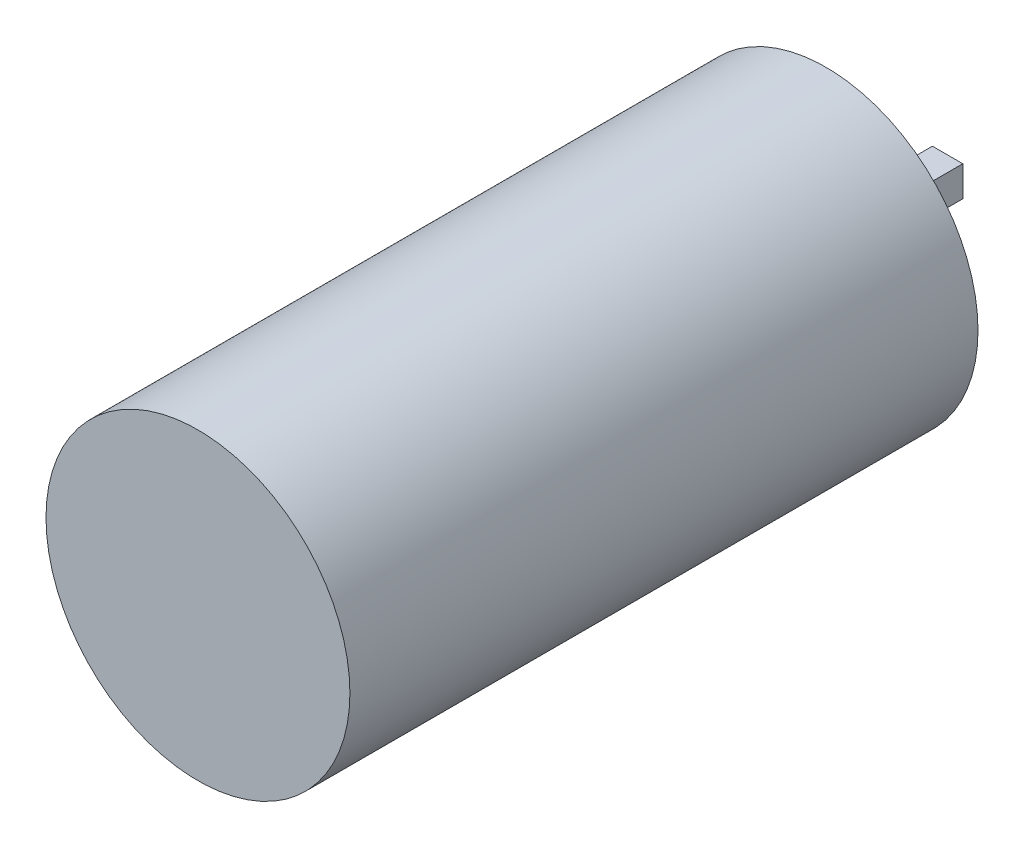
ISO-10303-21;
HEADER;
FILE_DESCRIPTION(('STEP AP214'),'2;1');
FILE_NAME('part.step','',(''),(''),'','','');
FILE_SCHEMA(('AUTOMOTIVE_DESIGN { 1 0 10303 214 1 1 1 1 }'));
ENDSEC;
DATA;
#1=APPLICATION_CONTEXT('core data for automotive mechanical design processes');
#2=APPLICATION_PROTOCOL_DEFINITION('international standard','automotive_design',2000,#1);
#3=PRODUCT_CONTEXT('',#1,'mechanical');
#4=PRODUCT('Part','Part','',(#3));
#5=PRODUCT_RELATED_PRODUCT_CATEGORY('part','',(#4));
#6=PRODUCT_DEFINITION_FORMATION('','',#4);
#7=PRODUCT_DEFINITION_CONTEXT('part definition',#1,'design');
#8=PRODUCT_DEFINITION('design','',#6,#7);
#9=PRODUCT_DEFINITION_SHAPE('','',#8);
#10=(LENGTH_UNIT() NAMED_UNIT(*) SI_UNIT(.MILLI.,.METRE.));
#11=(NAMED_UNIT(*) PLANE_ANGLE_UNIT() SI_UNIT($,.RADIAN.));
#12=(NAMED_UNIT(*) SI_UNIT($,.STERADIAN.) SOLID_ANGLE_UNIT());
#13=UNCERTAINTY_MEASURE_WITH_UNIT(LENGTH_MEASURE(1.E-05),#10,'distance_accuracy_value','');
#14=(GEOMETRIC_REPRESENTATION_CONTEXT(3) GLOBAL_UNCERTAINTY_ASSIGNED_CONTEXT((#13)) GLOBAL_UNIT_ASSIGNED_CONTEXT((#10,
#11,#12)) REPRESENTATION_CONTEXT('',''));
#15=CARTESIAN_POINT('',(0.,0.,0.));
#16=DIRECTION('',(0.,0.,1.));
#17=DIRECTION('',(1.,0.,0.));
#18=AXIS2_PLACEMENT_3D('',#15,#16,#17);
#19=CARTESIAN_POINT('',(0.,0.,0.));
#20=DIRECTION('',(0.,0.,1.));
#21=DIRECTION('',(1.,0.,0.));
#22=AXIS2_PLACEMENT_3D('',#19,#20,#21);
#23=PLANE('',#22);
#24=CARTESIAN_POINT('',(0.,0.,0.));
#25=DIRECTION('',(0.,0.,1.));
#26=DIRECTION('',(1.,0.,0.));
#27=AXIS2_PLACEMENT_3D('',#24,#25,#26);
#28=CIRCLE('',#27,15.);
#29=CARTESIAN_POINT('',(15.,0.,0.));
#30=VERTEX_POINT('',#29);
#31=EDGE_CURVE('E37',#30,#30,#28,.T.);
#32=ORIENTED_EDGE('',*,*,#31,.F.);
#33=EDGE_LOOP('',(#32));
#34=FACE_BOUND('',#33,.T.);
#35=DIRECTION('',(0.,-1.,0.));
#36=VECTOR('',#35,1.);
#37=CARTESIAN_POINT('',(1.5,-1.5,0.));
#38=LINE('',#37,#36);
#39=CARTESIAN_POINT('',(1.5,1.5,0.));
#40=VERTEX_POINT('',#39);
#41=CARTESIAN_POINT('',(1.5,-1.5,0.));
#42=VERTEX_POINT('',#41);
#43=EDGE_CURVE('E94',#40,#42,#38,.T.);
#44=ORIENTED_EDGE('',*,*,#43,.F.);
#45=DIRECTION('',(1.,0.,0.));
#46=VECTOR('',#45,1.);
#47=CARTESIAN_POINT('',(-1.5,1.5,0.));
#48=LINE('',#47,#46);
#49=CARTESIAN_POINT('',(-1.5,1.5,0.));
#50=VERTEX_POINT('',#49);
#51=EDGE_CURVE('E91',#50,#40,#48,.T.);
#52=ORIENTED_EDGE('',*,*,#51,.F.);
#53=DIRECTION('',(0.,1.,0.));
#54=VECTOR('',#53,1.);
#55=CARTESIAN_POINT('',(-1.5,-1.5,0.));
#56=LINE('',#55,#54);
#57=CARTESIAN_POINT('',(-1.5,-1.5,0.));
#58=VERTEX_POINT('',#57);
#59=EDGE_CURVE('E53',#58,#50,#56,.T.);
#60=ORIENTED_EDGE('',*,*,#59,.F.);
#61=DIRECTION('',(-1.,0.,0.));
#62=VECTOR('',#61,1.);
#63=CARTESIAN_POINT('',(-1.5,-1.5,0.));
#64=LINE('',#63,#62);
#65=EDGE_CURVE('E48',#42,#58,#64,.T.);
#66=ORIENTED_EDGE('',*,*,#65,.F.);
#67=EDGE_LOOP('',(#44,#52,#60,#66));
#68=FACE_BOUND('',#67,.T.);
#69=ADVANCED_FACE('F33',(#34,#68),#23,.F.);
#70=CARTESIAN_POINT('',(0.,0.,62.));
#71=DIRECTION('',(0.,0.,-1.));
#72=DIRECTION('',(-1.,0.,0.));
#73=AXIS2_PLACEMENT_3D('',#70,#71,#72);
#74=CYLINDRICAL_SURFACE('',#73,15.);
#75=CARTESIAN_POINT('',(0.,0.,62.));
#76=DIRECTION('',(0.,0.,1.));
#77=DIRECTION('',(1.,0.,0.));
#78=AXIS2_PLACEMENT_3D('',#75,#76,#77);
#79=CIRCLE('',#78,15.);
#80=CARTESIAN_POINT('',(15.,0.,62.));
#81=VERTEX_POINT('',#80);
#82=EDGE_CURVE('E11',#81,#81,#79,.T.);
#83=ORIENTED_EDGE('',*,*,#82,.F.);
#84=EDGE_LOOP('',(#83));
#85=FACE_BOUND('',#84,.T.);
#86=ORIENTED_EDGE('',*,*,#31,.T.);
#87=EDGE_LOOP('',(#86));
#88=FACE_BOUND('',#87,.T.);
#89=ADVANCED_FACE('F35',(#85,#88),#74,.T.);
#90=CARTESIAN_POINT('',(0.,0.,62.));
#91=DIRECTION('',(0.,0.,1.));
#92=DIRECTION('',(1.,0.,0.));
#93=AXIS2_PLACEMENT_3D('',#90,#91,#92);
#94=PLANE('',#93);
#95=ORIENTED_EDGE('',*,*,#82,.T.);
#96=EDGE_LOOP('',(#95));
#97=FACE_BOUND('',#96,.T.);
#98=ADVANCED_FACE('F120',(#97),#94,.T.);
#99=CARTESIAN_POINT('',(1.5,-1.5,-12.));
#100=DIRECTION('',(-1.,0.,0.));
#101=DIRECTION('',(0.,0.,1.));
#102=AXIS2_PLACEMENT_3D('',#99,#100,#101);
#103=PLANE('',#102);
#104=ORIENTED_EDGE('',*,*,#43,.T.);
#105=DIRECTION('',(0.,0.,1.));
#106=VECTOR('',#105,1.);
#107=CARTESIAN_POINT('',(1.5,-1.5,-12.));
#108=LINE('',#107,#106);
#109=CARTESIAN_POINT('',(1.5,-1.5,-12.));
#110=VERTEX_POINT('',#109);
#111=EDGE_CURVE('E75',#110,#42,#108,.T.);
#112=ORIENTED_EDGE('',*,*,#111,.F.);
#113=DIRECTION('',(0.,-1.,0.));
#114=VECTOR('',#113,1.);
#115=CARTESIAN_POINT('',(1.5,-1.5,-12.));
#116=LINE('',#115,#114);
#117=CARTESIAN_POINT('',(1.5,1.5,-12.));
#118=VERTEX_POINT('',#117);
#119=EDGE_CURVE('E82',#118,#110,#116,.T.);
#120=ORIENTED_EDGE('',*,*,#119,.F.);
#121=DIRECTION('',(0.,0.,1.));
#122=VECTOR('',#121,1.);
#123=CARTESIAN_POINT('',(1.5,1.5,-12.));
#124=LINE('',#123,#122);
#125=EDGE_CURVE('E102',#118,#40,#124,.T.);
#126=ORIENTED_EDGE('',*,*,#125,.T.);
#127=EDGE_LOOP('',(#104,#112,#120,#126));
#128=FACE_BOUND('',#127,.T.);
#129=ADVANCED_FACE('F93',(#128),#103,.F.);
#130=CARTESIAN_POINT('',(-1.5,-1.5,-12.));
#131=DIRECTION('',(0.,1.,0.));
#132=DIRECTION('',(-1.,0.,0.));
#133=AXIS2_PLACEMENT_3D('',#130,#131,#132);
#134=PLANE('',#133);
#135=ORIENTED_EDGE('',*,*,#65,.T.);
#136=DIRECTION('',(0.,0.,1.));
#137=VECTOR('',#136,1.);
#138=CARTESIAN_POINT('',(-1.5,-1.5,-12.));
#139=LINE('',#138,#137);
#140=CARTESIAN_POINT('',(-1.5,-1.5,-12.));
#141=VERTEX_POINT('',#140);
#142=EDGE_CURVE('E78',#141,#58,#139,.T.);
#143=ORIENTED_EDGE('',*,*,#142,.F.);
#144=DIRECTION('',(-1.,0.,0.));
#145=VECTOR('',#144,1.);
#146=CARTESIAN_POINT('',(-1.5,-1.5,-12.));
#147=LINE('',#146,#145);
#148=EDGE_CURVE('E71',#110,#141,#147,.T.);
#149=ORIENTED_EDGE('',*,*,#148,.F.);
#150=ORIENTED_EDGE('',*,*,#111,.T.);
#151=EDGE_LOOP('',(#135,#143,#149,#150));
#152=FACE_BOUND('',#151,.T.);
#153=ADVANCED_FACE('F73',(#152),#134,.F.);
#154=CARTESIAN_POINT('',(-1.5,-1.5,-12.));
#155=DIRECTION('',(1.,0.,0.));
#156=DIRECTION('',(0.,0.,-1.));
#157=AXIS2_PLACEMENT_3D('',#154,#155,#156);
#158=PLANE('',#157);
#159=ORIENTED_EDGE('',*,*,#59,.T.);
#160=DIRECTION('',(0.,0.,1.));
#161=VECTOR('',#160,1.);
#162=CARTESIAN_POINT('',(-1.5,1.5,-12.));
#163=LINE('',#162,#161);
#164=CARTESIAN_POINT('',(-1.5,1.5,-12.));
#165=VERTEX_POINT('',#164);
#166=EDGE_CURVE('E97',#165,#50,#163,.T.);
#167=ORIENTED_EDGE('',*,*,#166,.F.);
#168=DIRECTION('',(0.,1.,0.));
#169=VECTOR('',#168,1.);
#170=CARTESIAN_POINT('',(-1.5,-1.5,-12.));
#171=LINE('',#170,#169);
#172=EDGE_CURVE('E81',#141,#165,#171,.T.);
#173=ORIENTED_EDGE('',*,*,#172,.F.);
#174=ORIENTED_EDGE('',*,*,#142,.T.);
#175=EDGE_LOOP('',(#159,#167,#173,#174));
#176=FACE_BOUND('',#175,.T.);
#177=ADVANCED_FACE('F112',(#176),#158,.F.);
#178=CARTESIAN_POINT('',(-1.5,1.5,-12.));
#179=DIRECTION('',(0.,-1.,0.));
#180=DIRECTION('',(1.,0.,0.));
#181=AXIS2_PLACEMENT_3D('',#178,#179,#180);
#182=PLANE('',#181);
#183=ORIENTED_EDGE('',*,*,#51,.T.);
#184=ORIENTED_EDGE('',*,*,#125,.F.);
#185=DIRECTION('',(1.,0.,0.));
#186=VECTOR('',#185,1.);
#187=CARTESIAN_POINT('',(-1.5,1.5,-12.));
#188=LINE('',#187,#186);
#189=EDGE_CURVE('E87',#165,#118,#188,.T.);
#190=ORIENTED_EDGE('',*,*,#189,.F.);
#191=ORIENTED_EDGE('',*,*,#166,.T.);
#192=EDGE_LOOP('',(#183,#184,#190,#191));
#193=FACE_BOUND('',#192,.T.);
#194=ADVANCED_FACE('F114',(#193),#182,.F.);
#195=CARTESIAN_POINT('',(0.,0.,-12.));
#196=DIRECTION('',(0.,0.,-1.));
#197=DIRECTION('',(-1.,0.,0.));
#198=AXIS2_PLACEMENT_3D('',#195,#196,#197);
#199=PLANE('',#198);
#200=ORIENTED_EDGE('',*,*,#119,.T.);
#201=ORIENTED_EDGE('',*,*,#148,.T.);
#202=ORIENTED_EDGE('',*,*,#172,.T.);
#203=ORIENTED_EDGE('',*,*,#189,.T.);
#204=EDGE_LOOP('',(#200,#201,#202,#203));
#205=FACE_BOUND('',#204,.T.);
#206=ADVANCED_FACE('F85',(#205),#199,.T.);
#207=CLOSED_SHELL('',(#69,#89,#98,#129,#153,#177,#194,#206));
#208=MANIFOLD_SOLID_BREP('B2',#207);
#209=ADVANCED_BREP_SHAPE_REPRESENTATION('',(#18,#208),#14);
#210=SHAPE_DEFINITION_REPRESENTATION(#9,#209);
ENDSEC;
END-ISO-10303-21;
